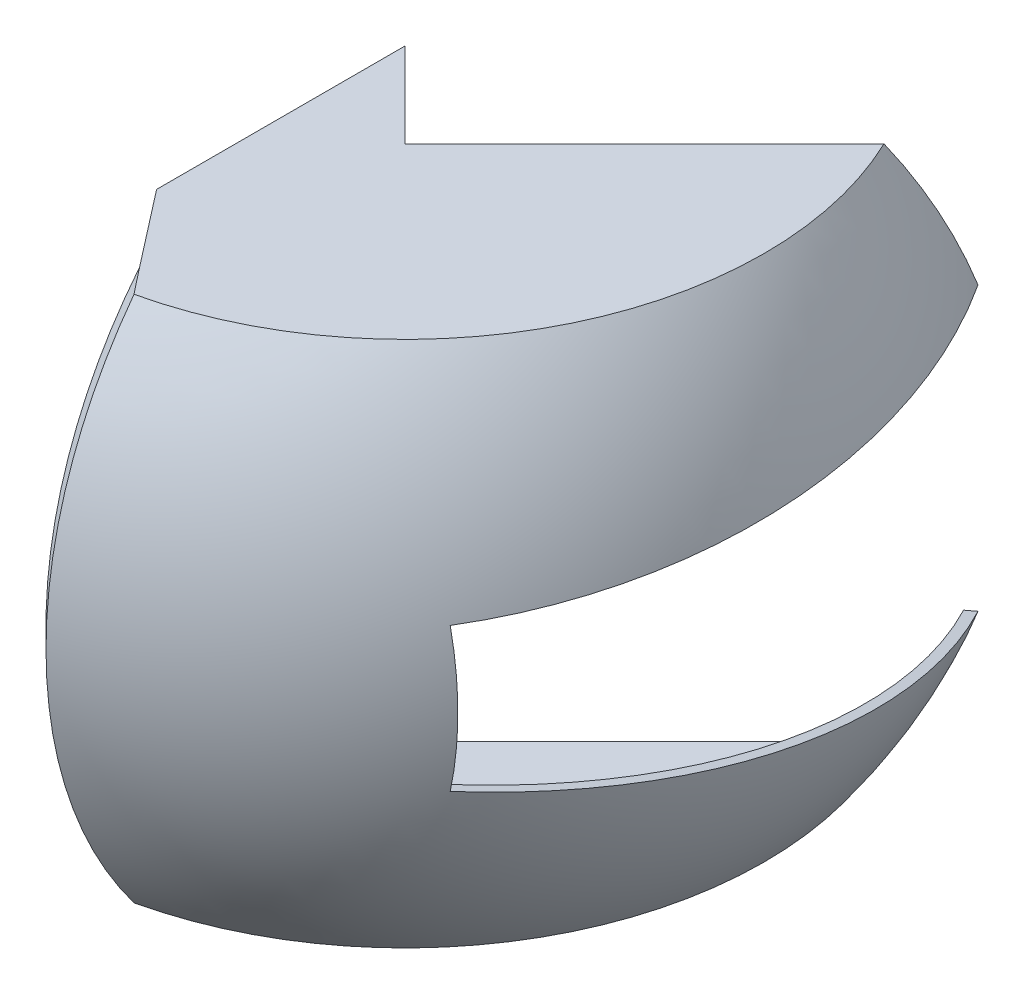
ISO-10303-21;
HEADER;
FILE_DESCRIPTION(('STEP AP214'),'2;1');
FILE_NAME('part.step','',(''),(''),'','','');
FILE_SCHEMA(('AUTOMOTIVE_DESIGN { 1 0 10303 214 1 1 1 1 }'));
ENDSEC;
DATA;
#1=APPLICATION_CONTEXT('core data for automotive mechanical design processes');
#2=APPLICATION_PROTOCOL_DEFINITION('international standard','automotive_design',2000,#1);
#3=PRODUCT_CONTEXT('',#1,'mechanical');
#4=PRODUCT('Part','Part','',(#3));
#5=PRODUCT_RELATED_PRODUCT_CATEGORY('part','',(#4));
#6=PRODUCT_DEFINITION_FORMATION('','',#4);
#7=PRODUCT_DEFINITION_CONTEXT('part definition',#1,'design');
#8=PRODUCT_DEFINITION('design','',#6,#7);
#9=PRODUCT_DEFINITION_SHAPE('','',#8);
#10=(LENGTH_UNIT() NAMED_UNIT(*) SI_UNIT(.MILLI.,.METRE.));
#11=(NAMED_UNIT(*) PLANE_ANGLE_UNIT() SI_UNIT($,.RADIAN.));
#12=(NAMED_UNIT(*) SI_UNIT($,.STERADIAN.) SOLID_ANGLE_UNIT());
#13=UNCERTAINTY_MEASURE_WITH_UNIT(LENGTH_MEASURE(1.E-05),#10,'distance_accuracy_value','');
#14=(GEOMETRIC_REPRESENTATION_CONTEXT(3) GLOBAL_UNCERTAINTY_ASSIGNED_CONTEXT((#13)) GLOBAL_UNIT_ASSIGNED_CONTEXT((#10,
#11,#12)) REPRESENTATION_CONTEXT('',''));
#15=CARTESIAN_POINT('',(0.,0.,0.));
#16=DIRECTION('',(0.,0.,1.));
#17=DIRECTION('',(1.,0.,0.));
#18=AXIS2_PLACEMENT_3D('',#15,#16,#17);
#19=CARTESIAN_POINT('',(12.2872806643349,55.,48.6036465452657));
#20=DIRECTION('',(1.,0.,0.));
#21=DIRECTION('',(0.,0.,-1.));
#22=AXIS2_PLACEMENT_3D('',#19,#20,#21);
#23=PLANE('',#22);
#24=DIRECTION('',(0.,1.,0.));
#25=VECTOR('',#24,1.);
#26=CARTESIAN_POINT('',(12.2872806643349,53.,67.6544254972797));
#27=LINE('',#26,#25);
#28=CARTESIAN_POINT('',(12.2872806643349,53.,67.6544254972797));
#29=VERTEX_POINT('',#28);
#30=CARTESIAN_POINT('',(12.2872806643349,55.,67.6544254972796));
#31=VERTEX_POINT('',#30);
#32=EDGE_CURVE('E57',#29,#31,#27,.T.);
#33=ORIENTED_EDGE('',*,*,#32,.F.);
#34=DIRECTION('',(0.,0.,1.));
#35=VECTOR('',#34,1.);
#36=CARTESIAN_POINT('',(12.2872806643349,53.,48.6036465452657));
#37=LINE('',#36,#35);
#38=CARTESIAN_POINT('',(12.2872806643349,53.,65.6345895867118));
#39=VERTEX_POINT('',#38);
#40=EDGE_CURVE('E177',#39,#29,#37,.T.);
#41=ORIENTED_EDGE('',*,*,#40,.F.);
#42=CARTESIAN_POINT('',(12.2872806643349,0.,0.));
#43=DIRECTION('',(1.,0.,0.));
#44=DIRECTION('',(0.,0.,-1.));
#45=AXIS2_PLACEMENT_3D('',#42,#43,#44);
#46=CIRCLE('',#45,84.3617173261432);
#47=CARTESIAN_POINT('',(12.2872806643349,-53.,65.6345895867118));
#48=VERTEX_POINT('',#47);
#49=EDGE_CURVE('E214',#48,#39,#46,.F.);
#50=ORIENTED_EDGE('',*,*,#49,.F.);
#51=DIRECTION('',(0.,0.,1.));
#52=VECTOR('',#51,1.);
#53=CARTESIAN_POINT('',(12.2872806643349,-53.,48.6036465452657));
#54=LINE('',#53,#52);
#55=CARTESIAN_POINT('',(12.2872806643349,-53.,67.6544254972797));
#56=VERTEX_POINT('',#55);
#57=EDGE_CURVE('E190',#48,#56,#54,.T.);
#58=ORIENTED_EDGE('',*,*,#57,.T.);
#59=DIRECTION('',(0.,-1.,0.));
#60=VECTOR('',#59,1.);
#61=CARTESIAN_POINT('',(12.2872806643349,-53.,67.6544254972797));
#62=LINE('',#61,#60);
#63=CARTESIAN_POINT('',(12.2872806643349,-55.,67.6544254972797));
#64=VERTEX_POINT('',#63);
#65=EDGE_CURVE('E196',#56,#64,#62,.T.);
#66=ORIENTED_EDGE('',*,*,#65,.T.);
#67=CARTESIAN_POINT('',(12.2872806643349,0.,0.));
#68=DIRECTION('',(1.,0.,0.));
#69=DIRECTION('',(0.,0.,-1.));
#70=AXIS2_PLACEMENT_3D('',#67,#68,#69);
#71=CIRCLE('',#70,87.1901444508894);
#72=EDGE_CURVE('E50',#64,#31,#71,.F.);
#73=ORIENTED_EDGE('',*,*,#72,.T.);
#74=EDGE_LOOP('',(#33,#41,#50,#58,#66,#73));
#75=FACE_BOUND('',#74,.T.);
#76=ADVANCED_FACE('F35',(#75),#23,.F.);
#77=CARTESIAN_POINT('',(0.,0.,0.));
#78=DIRECTION('',(-1.,0.,0.));
#79=DIRECTION('',(0.,0.,1.));
#80=AXIS2_PLACEMENT_3D('',#77,#78,#79);
#81=PLANE('',#80);
#82=DIRECTION('',(0.,0.,-1.));
#83=VECTOR('',#82,1.);
#84=CARTESIAN_POINT('',(0.,-55.,0.));
#85=LINE('',#84,#83);
#86=CARTESIAN_POINT('',(0.,-55.,51.8191010797357));
#87=VERTEX_POINT('',#86);
#88=CARTESIAN_POINT('',(0.,-55.,0.));
#89=VERTEX_POINT('',#88);
#90=EDGE_CURVE('E305',#87,#89,#85,.T.);
#91=ORIENTED_EDGE('',*,*,#90,.F.);
#92=DIRECTION('',(0.,-1.,0.));
#93=VECTOR('',#92,1.);
#94=CARTESIAN_POINT('',(0.,-53.,51.8191010797357));
#95=LINE('',#94,#93);
#96=CARTESIAN_POINT('',(0.,-53.,51.8191010797357));
#97=VERTEX_POINT('',#96);
#98=EDGE_CURVE('E199',#97,#87,#95,.T.);
#99=ORIENTED_EDGE('',*,*,#98,.F.);
#100=DIRECTION('',(0.,0.,-1.));
#101=VECTOR('',#100,1.);
#102=CARTESIAN_POINT('',(0.,-53.,0.));
#103=LINE('',#102,#101);
#104=CARTESIAN_POINT('',(0.,-53.,0.));
#105=VERTEX_POINT('',#104);
#106=EDGE_CURVE('E171',#97,#105,#103,.T.);
#107=ORIENTED_EDGE('',*,*,#106,.T.);
#108=DIRECTION('',(0.,-1.,0.));
#109=VECTOR('',#108,1.);
#110=CARTESIAN_POINT('',(0.,55.,0.));
#111=LINE('',#110,#109);
#112=EDGE_CURVE('E289',#105,#89,#111,.T.);
#113=ORIENTED_EDGE('',*,*,#112,.T.);
#114=EDGE_LOOP('',(#91,#99,#107,#113));
#115=FACE_BOUND('',#114,.T.);
#116=ADVANCED_FACE('F340',(#115),#81,.T.);
#117=CARTESIAN_POINT('',(0.,55.,0.));
#118=DIRECTION('',(-0.707106781186546,0.,0.707106781186549));
#119=DIRECTION('',(0.707106781186549,0.,0.707106781186546));
#120=AXIS2_PLACEMENT_3D('',#117,#118,#119);
#121=PLANE('',#120);
#122=DIRECTION('',(-0.707106781186549,0.,-0.707106781186546));
#123=VECTOR('',#122,1.);
#124=CARTESIAN_POINT('',(0.,-53.,0.));
#125=LINE('',#124,#123);
#126=CARTESIAN_POINT('',(17.6776695296637,-53.,17.6776695296637));
#127=VERTEX_POINT('',#126);
#128=EDGE_CURVE('E253',#127,#105,#125,.T.);
#129=ORIENTED_EDGE('',*,*,#128,.F.);
#130=DIRECTION('',(0.,-1.,0.));
#131=VECTOR('',#130,1.);
#132=CARTESIAN_POINT('',(17.6776695296637,55.,17.6776695296637));
#133=LINE('',#132,#131);
#134=CARTESIAN_POINT('',(17.6776695296637,-55.,17.6776695296637));
#135=VERTEX_POINT('',#134);
#136=EDGE_CURVE('E298',#127,#135,#133,.T.);
#137=ORIENTED_EDGE('',*,*,#136,.T.);
#138=DIRECTION('',(-0.707106781186549,0.,-0.707106781186546));
#139=VECTOR('',#138,1.);
#140=CARTESIAN_POINT('',(0.,-55.,0.));
#141=LINE('',#140,#139);
#142=EDGE_CURVE('E281',#135,#89,#141,.T.);
#143=ORIENTED_EDGE('',*,*,#142,.T.);
#144=ORIENTED_EDGE('',*,*,#112,.F.);
#145=EDGE_LOOP('',(#129,#137,#143,#144));
#146=FACE_BOUND('',#145,.T.);
#147=ADVANCED_FACE('F345',(#146),#121,.F.);
#148=CARTESIAN_POINT('',(17.6776695296637,55.,17.6776695296637));
#149=DIRECTION('',(0.70710678118655,0.,0.707106781186545));
#150=DIRECTION('',(0.707106781186545,0.,-0.70710678118655));
#151=AXIS2_PLACEMENT_3D('',#148,#149,#150);
#152=PLANE('',#151);
#153=DIRECTION('',(-0.707106781186545,0.,0.70710678118655));
#154=VECTOR('',#153,1.);
#155=CARTESIAN_POINT('',(17.6776695296637,-53.,17.6776695296636));
#156=LINE('',#155,#154);
#157=CARTESIAN_POINT('',(66.9116948335387,-53.,-31.5563557742117));
#158=VERTEX_POINT('',#157);
#159=EDGE_CURVE('E244',#158,#127,#156,.T.);
#160=ORIENTED_EDGE('',*,*,#159,.F.);
#161=CARTESIAN_POINT('',(17.6776695296637,0.,17.6776695296636));
#162=DIRECTION('',(0.70710678118655,0.,0.707106781186545));
#163=DIRECTION('',(0.707106781186545,0.,-0.70710678118655));
#164=AXIS2_PLACEMENT_3D('',#161,#162,#163);
#165=CIRCLE('',#164,87.5041627309538);
#166=CARTESIAN_POINT('',(75.9845002304106,-29.2849019550017,-40.6291611710837));
#167=VERTEX_POINT('',#166);
#168=EDGE_CURVE('E172',#158,#167,#165,.T.);
#169=ORIENTED_EDGE('',*,*,#168,.T.);
#170=DIRECTION('',(0.703571165799067,-0.0998760697678761,-0.703571165799071));
#171=VECTOR('',#170,1.);
#172=CARTESIAN_POINT('',(12.3365999792512,-20.24970774143,23.0187390800762));
#173=LINE('',#172,#171);
#174=CARTESIAN_POINT('',(77.489199876667,-29.4985029297923,-42.1338608173401));
#175=VERTEX_POINT('',#174);
#176=EDGE_CURVE('E273',#167,#175,#173,.T.);
#177=ORIENTED_EDGE('',*,*,#176,.T.);
#178=CARTESIAN_POINT('',(17.6776695296637,0.,17.6776695296636));
#179=DIRECTION('',(0.70710678118655,0.,0.707106781186545));
#180=DIRECTION('',(0.707106781186545,0.,-0.70710678118655));
#181=AXIS2_PLACEMENT_3D('',#178,#179,#180);
#182=CIRCLE('',#181,89.5823643358446);
#183=CARTESIAN_POINT('',(67.6776695296636,-55.,-32.3223304703366));
#184=VERTEX_POINT('',#183);
#185=EDGE_CURVE('E300',#184,#175,#182,.T.);
#186=ORIENTED_EDGE('',*,*,#185,.F.);
#187=DIRECTION('',(-0.707106781186545,0.,0.70710678118655));
#188=VECTOR('',#187,1.);
#189=CARTESIAN_POINT('',(17.6776695296637,-55.,17.6776695296637));
#190=LINE('',#189,#188);
#191=EDGE_CURVE('E286',#184,#135,#190,.T.);
#192=ORIENTED_EDGE('',*,*,#191,.T.);
#193=ORIENTED_EDGE('',*,*,#136,.F.);
#194=EDGE_LOOP('',(#160,#169,#177,#186,#192,#193));
#195=FACE_BOUND('',#194,.T.);
#196=ADVANCED_FACE('F337',(#195),#152,.F.);
#197=CARTESIAN_POINT('',(0.,55.,0.));
#198=DIRECTION('',(0.,-1.,0.));
#199=DIRECTION('',(0.,0.,-1.));
#200=AXIS2_PLACEMENT_3D('',#197,#198,#199);
#201=PLANE('',#200);
#202=DIRECTION('',(-0.613036128976875,0.,-0.790054874403701));
#203=VECTOR('',#202,1.);
#204=CARTESIAN_POINT('',(12.2872806643349,55.,67.6544254972797));
#205=LINE('',#204,#203);
#206=CARTESIAN_POINT('',(0.,55.,51.8191010797357));
#207=VERTEX_POINT('',#206);
#208=EDGE_CURVE('E179',#31,#207,#205,.T.);
#209=ORIENTED_EDGE('',*,*,#208,.F.);
#210=CARTESIAN_POINT('',(12.2872806643349,55.,67.6544254972796));
#211=CARTESIAN_POINT('',(12.6439303032145,55.,68.1140587831876));
#212=CARTESIAN_POINT('',(13.0014808741294,55.,68.5729925023131));
#213=CARTESIAN_POINT('',(13.7182975260488,55.,69.4895087756792));
#214=CARTESIAN_POINT('',(14.077563584871,55.,69.9470913472678));
#215=CARTESIAN_POINT('',(14.7977337330616,55.,70.8609647294817));
#216=CARTESIAN_POINT('',(15.158637820936,55.,71.3172555412845));
#217=CARTESIAN_POINT('',(15.8820145741686,55.,72.2286017574101));
#218=CARTESIAN_POINT('',(16.2444872596942,55.,72.683657145726));
#219=CARTESIAN_POINT('',(16.6077046993767,55.,73.1381169064278));
#220=B_SPLINE_CURVE_WITH_KNOTS('',3,(#210,#211,#212,#213,#214,#215,#216,#217,#218,#219),
.UNSPECIFIED.,.F.,.F.,(4,2,2,2,4),(0.,1.74532221552484,3.49062192368653,5.23592004032604,
6.98124066332973),.UNSPECIFIED.);
#221=CARTESIAN_POINT('',(16.6077046993767,55.,73.1381169064278));
#222=VERTEX_POINT('',#221);
#223=EDGE_CURVE('E11',#31,#222,#220,.T.);
#224=ORIENTED_EDGE('',*,*,#223,.T.);
#225=CARTESIAN_POINT('',(0.,55.,0.));
#226=DIRECTION('',(0.,-1.,0.));
#227=DIRECTION('',(0.,0.,-1.));
#228=AXIS2_PLACEMENT_3D('',#225,#226,#227);
#229=CIRCLE('',#228,75.);
#230=CARTESIAN_POINT('',(67.6776695296636,55.,-32.3223304703365));
#231=VERTEX_POINT('',#230);
#232=EDGE_CURVE('E311',#231,#222,#229,.T.);
#233=ORIENTED_EDGE('',*,*,#232,.F.);
#234=DIRECTION('',(-0.707106781186545,0.,0.70710678118655));
#235=VECTOR('',#234,1.);
#236=CARTESIAN_POINT('',(17.6776695296637,55.,17.6776695296637));
#237=LINE('',#236,#235);
#238=CARTESIAN_POINT('',(17.6776695296637,55.,17.6776695296637));
#239=VERTEX_POINT('',#238);
#240=EDGE_CURVE('E285',#231,#239,#237,.T.);
#241=ORIENTED_EDGE('',*,*,#240,.T.);
#242=DIRECTION('',(-0.707106781186549,0.,-0.707106781186546));
#243=VECTOR('',#242,1.);
#244=CARTESIAN_POINT('',(0.,55.,0.));
#245=LINE('',#244,#243);
#246=CARTESIAN_POINT('',(0.,55.,0.));
#247=VERTEX_POINT('',#246);
#248=EDGE_CURVE('E282',#239,#247,#245,.T.);
#249=ORIENTED_EDGE('',*,*,#248,.T.);
#250=DIRECTION('',(0.,0.,-1.));
#251=VECTOR('',#250,1.);
#252=CARTESIAN_POINT('',(0.,55.,0.));
#253=LINE('',#252,#251);
#254=EDGE_CURVE('E303',#207,#247,#253,.T.);
#255=ORIENTED_EDGE('',*,*,#254,.F.);
#256=EDGE_LOOP('',(#209,#224,#233,#241,#249,#255));
#257=FACE_BOUND('',#256,.T.);
#258=ADVANCED_FACE('F329',(#257),#201,.F.);
#259=CARTESIAN_POINT('',(0.,0.,0.));
#260=DIRECTION('',(0.,-1.,0.));
#261=DIRECTION('',(0.,0.,-1.));
#262=AXIS2_PLACEMENT_3D('',#259,#260,#261);
#263=SPHERICAL_SURFACE('',#262,93.0053761886914);
#264=ORIENTED_EDGE('',*,*,#232,.T.);
#265=CARTESIAN_POINT('',(16.6077046993767,0.,0.));
#266=DIRECTION('',(-1.,0.,0.));
#267=DIRECTION('',(0.,0.,1.));
#268=AXIS2_PLACEMENT_3D('',#265,#266,#267);
#269=CIRCLE('',#268,91.5105684859312);
#270=CARTESIAN_POINT('',(16.6077046993767,-55.,73.1381169064278));
#271=VERTEX_POINT('',#270);
#272=EDGE_CURVE('E314',#222,#271,#269,.F.);
#273=ORIENTED_EDGE('',*,*,#272,.T.);
#274=CARTESIAN_POINT('',(0.,-55.,0.));
#275=DIRECTION('',(0.,-1.,0.));
#276=DIRECTION('',(0.,0.,-1.));
#277=AXIS2_PLACEMENT_3D('',#274,#275,#276);
#278=CIRCLE('',#277,75.);
#279=EDGE_CURVE('E308',#184,#271,#278,.T.);
#280=ORIENTED_EDGE('',*,*,#279,.F.);
#281=ORIENTED_EDGE('',*,*,#185,.T.);
#282=CARTESIAN_POINT('',(0.,-23.0528052823745,3.27248144985128));
#283=DIRECTION('',(0.,-0.990074030670294,0.140546838428607));
#284=DIRECTION('',(0.,-0.140546838428607,-0.990074030670294));
#285=AXIS2_PLACEMENT_3D('',#282,#283,#284);
#286=CIRCLE('',#285,90.0436507132697);
#287=CARTESIAN_POINT('',(69.462219947249,-15.,60.));
#288=VERTEX_POINT('',#287);
#289=EDGE_CURVE('E275',#175,#288,#286,.T.);
#290=ORIENTED_EDGE('',*,*,#289,.T.);
#291=CARTESIAN_POINT('',(0.,0.,60.));
#292=DIRECTION('',(0.,0.,1.));
#293=DIRECTION('',(1.,0.,0.));
#294=AXIS2_PLACEMENT_3D('',#291,#292,#293);
#295=CIRCLE('',#294,71.0633520177595);
#296=CARTESIAN_POINT('',(69.462219947249,15.,60.));
#297=VERTEX_POINT('',#296);
#298=EDGE_CURVE('E278',#288,#297,#295,.T.);
#299=ORIENTED_EDGE('',*,*,#298,.T.);
#300=CARTESIAN_POINT('',(0.,23.0528052823745,3.27248144985128));
#301=DIRECTION('',(0.,0.990074030670294,0.140546838428607));
#302=DIRECTION('',(0.,-0.140546838428607,0.990074030670294));
#303=AXIS2_PLACEMENT_3D('',#300,#301,#302);
#304=CIRCLE('',#303,90.0436507132697);
#305=CARTESIAN_POINT('',(77.489199876667,29.4985029297923,-42.13386081734));
#306=VERTEX_POINT('',#305);
#307=EDGE_CURVE('E270',#297,#306,#304,.T.);
#308=ORIENTED_EDGE('',*,*,#307,.T.);
#309=EDGE_CURVE('E297',#306,#231,#182,.T.);
#310=ORIENTED_EDGE('',*,*,#309,.T.);
#311=EDGE_LOOP('',(#264,#273,#280,#281,#290,#299,#308,#310));
#312=FACE_BOUND('',#311,.T.);
#313=ADVANCED_FACE('F327',(#312),#263,.T.);
#314=CARTESIAN_POINT('',(0.,-55.,0.));
#315=DIRECTION('',(0.,-1.,0.));
#316=DIRECTION('',(0.,0.,-1.));
#317=AXIS2_PLACEMENT_3D('',#314,#315,#316);
#318=PLANE('',#317);
#319=ORIENTED_EDGE('',*,*,#279,.T.);
#320=CARTESIAN_POINT('',(16.6077046993767,-55.,73.1381169064278));
#321=CARTESIAN_POINT('',(16.2444872596942,-55.,72.6836571457261));
#322=CARTESIAN_POINT('',(15.8820145741686,-55.,72.2286017574102));
#323=CARTESIAN_POINT('',(15.158637820936,-55.,71.3172555412845));
#324=CARTESIAN_POINT('',(14.7977337330616,-55.,70.8609647294817));
#325=CARTESIAN_POINT('',(14.077563584871,-55.,69.9470913472678));
#326=CARTESIAN_POINT('',(13.7182975260488,-55.,69.4895087756792));
#327=CARTESIAN_POINT('',(13.0014808741294,-55.,68.5729925023132));
#328=CARTESIAN_POINT('',(12.6439303032145,-55.,68.1140587831877));
#329=CARTESIAN_POINT('',(12.2872806643349,-55.,67.6544254972797));
#330=B_SPLINE_CURVE_WITH_KNOTS('',3,(#320,#321,#322,#323,#324,#325,#326,#327,#328,#329),
.UNSPECIFIED.,.F.,.F.,(4,2,2,2,4),(0.,1.74532062300367,3.49061873964317,5.23591844780487,
6.98124066332971),.UNSPECIFIED.);
#331=EDGE_CURVE('E317',#271,#64,#330,.T.);
#332=ORIENTED_EDGE('',*,*,#331,.T.);
#333=DIRECTION('',(-0.613036128976875,0.,-0.790054874403701));
#334=VECTOR('',#333,1.);
#335=CARTESIAN_POINT('',(12.2872806643349,-55.,67.6544254972797));
#336=LINE('',#335,#334);
#337=EDGE_CURVE('E185',#64,#87,#336,.T.);
#338=ORIENTED_EDGE('',*,*,#337,.T.);
#339=ORIENTED_EDGE('',*,*,#90,.T.);
#340=ORIENTED_EDGE('',*,*,#142,.F.);
#341=ORIENTED_EDGE('',*,*,#191,.F.);
#342=EDGE_LOOP('',(#319,#332,#338,#339,#340,#341));
#343=FACE_BOUND('',#342,.T.);
#344=ADVANCED_FACE('F324',(#343),#318,.T.);
#345=DIRECTION('',(0.,0.,-1.));
#346=VECTOR('',#345,1.);
#347=CARTESIAN_POINT('',(0.,53.,0.));
#348=LINE('',#347,#346);
#349=CARTESIAN_POINT('',(0.,53.,51.8191010797357));
#350=VERTEX_POINT('',#349);
#351=CARTESIAN_POINT('',(0.,53.,0.));
#352=VERTEX_POINT('',#351);
#353=EDGE_CURVE('E162',#350,#352,#348,.T.);
#354=ORIENTED_EDGE('',*,*,#353,.F.);
#355=DIRECTION('',(0.,1.,0.));
#356=VECTOR('',#355,1.);
#357=CARTESIAN_POINT('',(0.,53.,51.8191010797357));
#358=LINE('',#357,#356);
#359=EDGE_CURVE('E167',#350,#207,#358,.T.);
#360=ORIENTED_EDGE('',*,*,#359,.T.);
#361=ORIENTED_EDGE('',*,*,#254,.T.);
#362=EDGE_CURVE('E168',#247,#352,#111,.T.);
#363=ORIENTED_EDGE('',*,*,#362,.T.);
#364=EDGE_LOOP('',(#354,#360,#361,#363));
#365=FACE_BOUND('',#364,.T.);
#366=ADVANCED_FACE('F164',(#365),#81,.T.);
#367=DIRECTION('',(-0.703571165799067,-0.0998760697678763,0.703571165799071));
#368=VECTOR('',#367,1.);
#369=CARTESIAN_POINT('',(20.0662914918727,21.3469829657806,15.2890475674547));
#370=LINE('',#369,#368);
#371=CARTESIAN_POINT('',(75.9845002304106,29.2849019550018,-40.6291611710837));
#372=VERTEX_POINT('',#371);
#373=EDGE_CURVE('E266',#306,#372,#370,.T.);
#374=ORIENTED_EDGE('',*,*,#373,.T.);
#375=CARTESIAN_POINT('',(17.6776695296637,0.,17.6776695296636));
#376=DIRECTION('',(0.70710678118655,0.,0.707106781186545));
#377=DIRECTION('',(0.707106781186545,0.,-0.70710678118655));
#378=AXIS2_PLACEMENT_3D('',#375,#376,#377);
#379=CIRCLE('',#378,87.5041627309538);
#380=CARTESIAN_POINT('',(66.9116948335387,53.,-31.5563557742117));
#381=VERTEX_POINT('',#380);
#382=EDGE_CURVE('E65',#372,#381,#379,.T.);
#383=ORIENTED_EDGE('',*,*,#382,.T.);
#384=DIRECTION('',(-0.707106781186545,0.,0.70710678118655));
#385=VECTOR('',#384,1.);
#386=CARTESIAN_POINT('',(17.6776695296637,53.,17.6776695296636));
#387=LINE('',#386,#385);
#388=CARTESIAN_POINT('',(17.6776695296637,53.,17.6776695296637));
#389=VERTEX_POINT('',#388);
#390=EDGE_CURVE('E243',#381,#389,#387,.T.);
#391=ORIENTED_EDGE('',*,*,#390,.T.);
#392=EDGE_CURVE('E294',#239,#389,#133,.T.);
#393=ORIENTED_EDGE('',*,*,#392,.F.);
#394=ORIENTED_EDGE('',*,*,#240,.F.);
#395=ORIENTED_EDGE('',*,*,#309,.F.);
#396=EDGE_LOOP('',(#374,#383,#391,#393,#394,#395));
#397=FACE_BOUND('',#396,.T.);
#398=ADVANCED_FACE('F349',(#397),#152,.F.);
#399=ORIENTED_EDGE('',*,*,#392,.T.);
#400=DIRECTION('',(-0.707106781186549,0.,-0.707106781186546));
#401=VECTOR('',#400,1.);
#402=CARTESIAN_POINT('',(0.,53.,0.));
#403=LINE('',#402,#401);
#404=EDGE_CURVE('E241',#389,#352,#403,.T.);
#405=ORIENTED_EDGE('',*,*,#404,.T.);
#406=ORIENTED_EDGE('',*,*,#362,.F.);
#407=ORIENTED_EDGE('',*,*,#248,.F.);
#408=EDGE_LOOP('',(#399,#405,#406,#407));
#409=FACE_BOUND('',#408,.T.);
#410=ADVANCED_FACE('F351',(#409),#121,.F.);
#411=CARTESIAN_POINT('',(0.,-15.,60.));
#412=DIRECTION('',(0.,0.,1.));
#413=DIRECTION('',(1.,0.,0.));
#414=AXIS2_PLACEMENT_3D('',#411,#412,#413);
#415=PLANE('',#414);
#416=DIRECTION('',(1.,0.,0.));
#417=VECTOR('',#416,1.);
#418=CARTESIAN_POINT('',(0.,-15.,60.));
#419=LINE('',#418,#417);
#420=CARTESIAN_POINT('',(66.7606058633775,-15.,60.));
#421=VERTEX_POINT('',#420);
#422=EDGE_CURVE('E264',#421,#288,#419,.T.);
#423=ORIENTED_EDGE('',*,*,#422,.F.);
#424=CARTESIAN_POINT('',(0.,0.,60.));
#425=DIRECTION('',(0.,0.,1.));
#426=DIRECTION('',(1.,0.,0.));
#427=AXIS2_PLACEMENT_3D('',#424,#425,#426);
#428=CIRCLE('',#427,68.4249844373036);
#429=CARTESIAN_POINT('',(66.7606058633775,15.,60.));
#430=VERTEX_POINT('',#429);
#431=EDGE_CURVE('E250',#421,#430,#428,.T.);
#432=ORIENTED_EDGE('',*,*,#431,.T.);
#433=DIRECTION('',(1.,0.,0.));
#434=VECTOR('',#433,1.);
#435=CARTESIAN_POINT('',(0.,15.,60.));
#436=LINE('',#435,#434);
#437=EDGE_CURVE('E213',#430,#297,#436,.T.);
#438=ORIENTED_EDGE('',*,*,#437,.T.);
#439=ORIENTED_EDGE('',*,*,#298,.F.);
#440=EDGE_LOOP('',(#423,#432,#438,#439));
#441=FACE_BOUND('',#440,.T.);
#442=ADVANCED_FACE('F353',(#441),#415,.F.);
#443=CARTESIAN_POINT('',(0.,-30.0000000000009,-45.6666277669362));
#444=DIRECTION('',(0.,-0.990074030670294,0.140546838428607));
#445=DIRECTION('',(0.,-0.140546838428607,-0.990074030670294));
#446=AXIS2_PLACEMENT_3D('',#443,#444,#445);
#447=PLANE('',#446);
#448=ORIENTED_EDGE('',*,*,#176,.F.);
#449=CARTESIAN_POINT('',(0.,-23.0528052823745,3.27248144985128));
#450=DIRECTION('',(0.,-0.990074030670294,0.140546838428607));
#451=DIRECTION('',(0.,-0.140546838428607,-0.990074030670294));
#452=AXIS2_PLACEMENT_3D('',#449,#450,#451);
#453=CIRCLE('',#452,87.9763464177647);
#454=EDGE_CURVE('E249',#167,#421,#453,.T.);
#455=ORIENTED_EDGE('',*,*,#454,.T.);
#456=ORIENTED_EDGE('',*,*,#422,.T.);
#457=ORIENTED_EDGE('',*,*,#289,.F.);
#458=EDGE_LOOP('',(#448,#455,#456,#457));
#459=FACE_BOUND('',#458,.T.);
#460=ADVANCED_FACE('F395',(#459),#447,.F.);
#461=CARTESIAN_POINT('',(0.,30.0000000000009,-45.6666277669362));
#462=DIRECTION('',(0.,0.990074030670294,0.140546838428607));
#463=DIRECTION('',(0.,-0.140546838428607,0.990074030670294));
#464=AXIS2_PLACEMENT_3D('',#461,#462,#463);
#465=PLANE('',#464);
#466=ORIENTED_EDGE('',*,*,#437,.F.);
#467=CARTESIAN_POINT('',(0.,23.0528052823745,3.27248144985128));
#468=DIRECTION('',(0.,0.990074030670294,0.140546838428607));
#469=DIRECTION('',(0.,-0.140546838428607,0.990074030670294));
#470=AXIS2_PLACEMENT_3D('',#467,#468,#469);
#471=CIRCLE('',#470,87.9763464177647);
#472=EDGE_CURVE('E202',#430,#372,#471,.T.);
#473=ORIENTED_EDGE('',*,*,#472,.T.);
#474=ORIENTED_EDGE('',*,*,#373,.F.);
#475=ORIENTED_EDGE('',*,*,#307,.F.);
#476=EDGE_LOOP('',(#466,#473,#474,#475));
#477=FACE_BOUND('',#476,.T.);
#478=ADVANCED_FACE('F389',(#477),#465,.F.);
#479=CARTESIAN_POINT('',(16.6077046993767,0.,0.));
#480=DIRECTION('',(1.,0.,0.));
#481=DIRECTION('',(0.,0.,-1.));
#482=AXIS2_PLACEMENT_3D('',#479,#480,#481);
#483=CONICAL_SURFACE('',#482,91.5105684859312,0.785398163397447);
#484=ORIENTED_EDGE('',*,*,#223,.F.);
#485=ORIENTED_EDGE('',*,*,#72,.F.);
#486=ORIENTED_EDGE('',*,*,#331,.F.);
#487=ORIENTED_EDGE('',*,*,#272,.F.);
#488=EDGE_LOOP('',(#484,#485,#486,#487));
#489=FACE_BOUND('',#488,.T.);
#490=ADVANCED_FACE('F38',(#489),#483,.T.);
#491=CARTESIAN_POINT('',(0.,53.,0.));
#492=DIRECTION('',(0.,-1.,0.));
#493=DIRECTION('',(0.,0.,-1.));
#494=AXIS2_PLACEMENT_3D('',#491,#492,#493);
#495=PLANE('',#494);
#496=CARTESIAN_POINT('',(12.2872806643349,53.,65.6345895867118));
#497=CARTESIAN_POINT('',(12.6984875961874,53.,66.163120739306));
#498=CARTESIAN_POINT('',(13.1109123609086,53.,66.690703475753));
#499=CARTESIAN_POINT('',(13.9380609308469,53.,67.7440490466758));
#500=CARTESIAN_POINT('',(14.352784696236,53.,68.2698119124243));
#501=CARTESIAN_POINT('',(15.1844082521367,53.,69.3196121616588));
#502=CARTESIAN_POINT('',(15.6013080394951,53.,69.8436495476432));
#503=CARTESIAN_POINT('',(16.4371755257092,53.,70.8900874435007));
#504=CARTESIAN_POINT('',(16.8561432601518,53.,71.4124879249497));
#505=CARTESIAN_POINT('',(17.276083410719,53.,71.9341048267865));
#506=B_SPLINE_CURVE_WITH_KNOTS('',3,(#496,#497,#498,#499,#500,#501,#502,#503,#504,#505),
.UNSPECIFIED.,.F.,.F.,(4,2,2,2,4),(0.,2.00895881775448,4.01788294028222,6.02680415255392,
8.03576005749605),.UNSPECIFIED.);
#507=CARTESIAN_POINT('',(17.276083410719,53.,71.9341048267865));
#508=VERTEX_POINT('',#507);
#509=EDGE_CURVE('E205',#39,#508,#506,.T.);
#510=ORIENTED_EDGE('',*,*,#509,.F.);
#511=ORIENTED_EDGE('',*,*,#40,.T.);
#512=DIRECTION('',(-0.613036128976875,0.,-0.790054874403701));
#513=VECTOR('',#512,1.);
#514=CARTESIAN_POINT('',(12.2872806643349,53.,67.6544254972797));
#515=LINE('',#514,#513);
#516=EDGE_CURVE('E175',#29,#350,#515,.T.);
#517=ORIENTED_EDGE('',*,*,#516,.T.);
#518=ORIENTED_EDGE('',*,*,#353,.T.);
#519=ORIENTED_EDGE('',*,*,#404,.F.);
#520=ORIENTED_EDGE('',*,*,#390,.F.);
#521=CARTESIAN_POINT('',(0.,53.,0.));
#522=DIRECTION('',(0.,-1.,0.));
#523=DIRECTION('',(0.,0.,-1.));
#524=AXIS2_PLACEMENT_3D('',#521,#522,#523);
#525=CIRCLE('',#524,73.9795816103689);
#526=EDGE_CURVE('E215',#381,#508,#525,.T.);
#527=ORIENTED_EDGE('',*,*,#526,.T.);
#528=EDGE_LOOP('',(#510,#511,#517,#518,#519,#520,#527));
#529=FACE_BOUND('',#528,.T.);
#530=ADVANCED_FACE('F176',(#529),#495,.T.);
#531=CARTESIAN_POINT('',(0.,0.,0.));
#532=DIRECTION('',(0.,-1.,0.));
#533=DIRECTION('',(0.,0.,-1.));
#534=AXIS2_PLACEMENT_3D('',#531,#532,#533);
#535=SPHERICAL_SURFACE('',#534,91.0053761886914);
#536=ORIENTED_EDGE('',*,*,#526,.F.);
#537=ORIENTED_EDGE('',*,*,#382,.F.);
#538=ORIENTED_EDGE('',*,*,#472,.F.);
#539=ORIENTED_EDGE('',*,*,#431,.F.);
#540=ORIENTED_EDGE('',*,*,#454,.F.);
#541=ORIENTED_EDGE('',*,*,#168,.F.);
#542=CARTESIAN_POINT('',(0.,-53.,0.));
#543=DIRECTION('',(0.,-1.,0.));
#544=DIRECTION('',(0.,0.,-1.));
#545=AXIS2_PLACEMENT_3D('',#542,#543,#544);
#546=CIRCLE('',#545,73.9795816103689);
#547=CARTESIAN_POINT('',(17.276083410719,-53.,71.9341048267865));
#548=VERTEX_POINT('',#547);
#549=EDGE_CURVE('E239',#158,#548,#546,.T.);
#550=ORIENTED_EDGE('',*,*,#549,.T.);
#551=CARTESIAN_POINT('',(17.276083410719,0.,0.));
#552=DIRECTION('',(1.,0.,0.));
#553=DIRECTION('',(0.,0.,-1.));
#554=AXIS2_PLACEMENT_3D('',#551,#552,#553);
#555=CIRCLE('',#554,89.3505200725273);
#556=EDGE_CURVE('E238',#508,#548,#555,.T.);
#557=ORIENTED_EDGE('',*,*,#556,.F.);
#558=EDGE_LOOP('',(#536,#537,#538,#539,#540,#541,#550,#557));
#559=FACE_BOUND('',#558,.T.);
#560=ADVANCED_FACE('F223',(#559),#535,.F.);
#561=CARTESIAN_POINT('',(0.,-53.,0.));
#562=DIRECTION('',(0.,-1.,0.));
#563=DIRECTION('',(0.,0.,-1.));
#564=AXIS2_PLACEMENT_3D('',#561,#562,#563);
#565=PLANE('',#564);
#566=ORIENTED_EDGE('',*,*,#549,.F.);
#567=ORIENTED_EDGE('',*,*,#159,.T.);
#568=ORIENTED_EDGE('',*,*,#128,.T.);
#569=ORIENTED_EDGE('',*,*,#106,.F.);
#570=DIRECTION('',(-0.613036128976875,0.,-0.790054874403701));
#571=VECTOR('',#570,1.);
#572=CARTESIAN_POINT('',(12.2872806643349,-53.,67.6544254972797));
#573=LINE('',#572,#571);
#574=EDGE_CURVE('E193',#56,#97,#573,.T.);
#575=ORIENTED_EDGE('',*,*,#574,.F.);
#576=ORIENTED_EDGE('',*,*,#57,.F.);
#577=CARTESIAN_POINT('',(17.276083410719,-53.,71.9341048267865));
#578=CARTESIAN_POINT('',(16.8561432601518,-53.,71.4124879249498));
#579=CARTESIAN_POINT('',(16.4371755257092,-53.,70.8900874435007));
#580=CARTESIAN_POINT('',(15.6013080394951,-53.,69.8436495476432));
#581=CARTESIAN_POINT('',(15.1844082521367,-53.,69.3196121616588));
#582=CARTESIAN_POINT('',(14.352784696236,-53.,68.2698119124243));
#583=CARTESIAN_POINT('',(13.938060930847,-53.,67.7440490466758));
#584=CARTESIAN_POINT('',(13.1109123609086,-53.,66.690703475753));
#585=CARTESIAN_POINT('',(12.6984875961874,-53.,66.163120739306));
#586=CARTESIAN_POINT('',(12.2872806643349,-53.,65.6345895867118));
#587=B_SPLINE_CURVE_WITH_KNOTS('',3,(#577,#578,#579,#580,#581,#582,#583,#584,#585,#586),
.UNSPECIFIED.,.F.,.F.,(4,2,2,2,4),(0.,2.00895590494213,4.01787711721383,6.02680123974157,
8.03576005749605),.UNSPECIFIED.);
#588=EDGE_CURVE('E231',#548,#48,#587,.T.);
#589=ORIENTED_EDGE('',*,*,#588,.F.);
#590=EDGE_LOOP('',(#566,#567,#568,#569,#575,#576,#589));
#591=FACE_BOUND('',#590,.T.);
#592=ADVANCED_FACE('F224',(#591),#565,.F.);
#593=CARTESIAN_POINT('',(18.0219182617498,0.,0.));
#594=DIRECTION('',(1.,0.,0.));
#595=DIRECTION('',(0.,0.,-1.));
#596=AXIS2_PLACEMENT_3D('',#593,#594,#595);
#597=CONICAL_SURFACE('',#596,90.0963549235581,0.785398163397447);
#598=ORIENTED_EDGE('',*,*,#509,.T.);
#599=ORIENTED_EDGE('',*,*,#556,.T.);
#600=ORIENTED_EDGE('',*,*,#588,.T.);
#601=ORIENTED_EDGE('',*,*,#49,.T.);
#602=EDGE_LOOP('',(#598,#599,#600,#601));
#603=FACE_BOUND('',#602,.T.);
#604=ADVANCED_FACE('F217',(#603),#597,.F.);
#605=CARTESIAN_POINT('',(12.2872806643349,-53.,67.6544254972797));
#606=DIRECTION('',(-0.790054874403701,0.,0.613036128976875));
#607=DIRECTION('',(0.613036128976875,0.,0.790054874403701));
#608=AXIS2_PLACEMENT_3D('',#605,#606,#607);
#609=PLANE('',#608);
#610=ORIENTED_EDGE('',*,*,#337,.F.);
#611=ORIENTED_EDGE('',*,*,#65,.F.);
#612=ORIENTED_EDGE('',*,*,#574,.T.);
#613=ORIENTED_EDGE('',*,*,#98,.T.);
#614=EDGE_LOOP('',(#610,#611,#612,#613));
#615=FACE_BOUND('',#614,.T.);
#616=ADVANCED_FACE('F403',(#615),#609,.T.);
#617=CARTESIAN_POINT('',(12.2872806643349,53.,67.6544254972797));
#618=DIRECTION('',(0.790054874403701,0.,-0.613036128976875));
#619=DIRECTION('',(-0.613036128976875,0.,-0.790054874403701));
#620=AXIS2_PLACEMENT_3D('',#617,#618,#619);
#621=PLANE('',#620);
#622=ORIENTED_EDGE('',*,*,#208,.T.);
#623=ORIENTED_EDGE('',*,*,#359,.F.);
#624=ORIENTED_EDGE('',*,*,#516,.F.);
#625=ORIENTED_EDGE('',*,*,#32,.T.);
#626=EDGE_LOOP('',(#622,#623,#624,#625));
#627=FACE_BOUND('',#626,.T.);
#628=ADVANCED_FACE('F182',(#627),#621,.F.);
#629=CLOSED_SHELL('',(#76,#116,#147,#196,#258,#313,#344,#366,#398,#410,#442,#460,#478,#490,#530,
#560,#592,#604,#616,#628));
#630=MANIFOLD_SOLID_BREP('B2',#629);
#631=ADVANCED_BREP_SHAPE_REPRESENTATION('',(#18,#630),#14);
#632=SHAPE_DEFINITION_REPRESENTATION(#9,#631);
ENDSEC;
END-ISO-10303-21;
